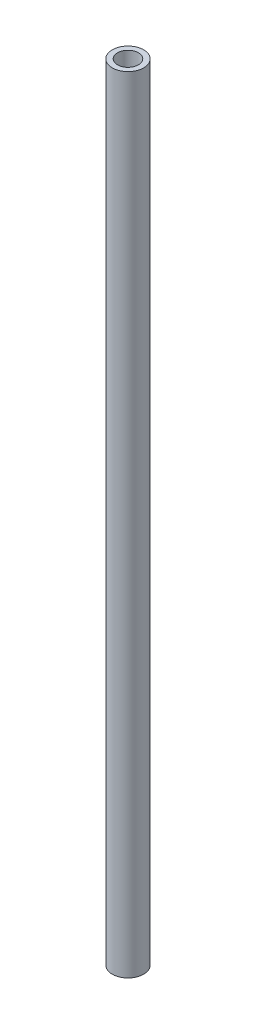
ISO-10303-21;
HEADER;
FILE_DESCRIPTION(('STEP AP214'),'2;1');
FILE_NAME('part.step','',(''),(''),'','','');
FILE_SCHEMA(('AUTOMOTIVE_DESIGN { 1 0 10303 214 1 1 1 1 }'));
ENDSEC;
DATA;
#1=APPLICATION_CONTEXT('core data for automotive mechanical design processes');
#2=APPLICATION_PROTOCOL_DEFINITION('international standard','automotive_design',2000,#1);
#3=PRODUCT_CONTEXT('',#1,'mechanical');
#4=PRODUCT('Part','Part','',(#3));
#5=PRODUCT_RELATED_PRODUCT_CATEGORY('part','',(#4));
#6=PRODUCT_DEFINITION_FORMATION('','',#4);
#7=PRODUCT_DEFINITION_CONTEXT('part definition',#1,'design');
#8=PRODUCT_DEFINITION('design','',#6,#7);
#9=PRODUCT_DEFINITION_SHAPE('','',#8);
#10=(LENGTH_UNIT() NAMED_UNIT(*) SI_UNIT(.MILLI.,.METRE.));
#11=(NAMED_UNIT(*) PLANE_ANGLE_UNIT() SI_UNIT($,.RADIAN.));
#12=(NAMED_UNIT(*) SI_UNIT($,.STERADIAN.) SOLID_ANGLE_UNIT());
#13=UNCERTAINTY_MEASURE_WITH_UNIT(LENGTH_MEASURE(1.E-05),#10,'distance_accuracy_value','');
#14=(GEOMETRIC_REPRESENTATION_CONTEXT(3) GLOBAL_UNCERTAINTY_ASSIGNED_CONTEXT((#13)) GLOBAL_UNIT_ASSIGNED_CONTEXT((#10,
#11,#12)) REPRESENTATION_CONTEXT('',''));
#15=CARTESIAN_POINT('',(0.,0.,0.));
#16=DIRECTION('',(0.,0.,1.));
#17=DIRECTION('',(1.,0.,0.));
#18=AXIS2_PLACEMENT_3D('',#15,#16,#17);
#19=CARTESIAN_POINT('',(0.,150.,0.));
#20=DIRECTION('',(0.,1.,0.));
#21=DIRECTION('',(0.,0.,1.));
#22=AXIS2_PLACEMENT_3D('',#19,#20,#21);
#23=PLANE('',#22);
#24=CARTESIAN_POINT('',(0.,150.,0.));
#25=DIRECTION('',(0.,1.,0.));
#26=DIRECTION('',(0.,0.,1.));
#27=AXIS2_PLACEMENT_3D('',#24,#25,#26);
#28=CIRCLE('',#27,6.);
#29=CARTESIAN_POINT('',(0.,150.,6.));
#30=VERTEX_POINT('',#29);
#31=EDGE_CURVE('E10',#30,#30,#28,.T.);
#32=ORIENTED_EDGE('',*,*,#31,.T.);
#33=EDGE_LOOP('',(#32));
#34=FACE_BOUND('',#33,.T.);
#35=CARTESIAN_POINT('',(0.,150.,0.));
#36=DIRECTION('',(0.,1.,0.));
#37=DIRECTION('',(0.,0.,1.));
#38=AXIS2_PLACEMENT_3D('',#35,#36,#37);
#39=CIRCLE('',#38,4.);
#40=CARTESIAN_POINT('',(0.,150.,4.));
#41=VERTEX_POINT('',#40);
#42=EDGE_CURVE('E56',#41,#41,#39,.T.);
#43=ORIENTED_EDGE('',*,*,#42,.F.);
#44=EDGE_LOOP('',(#43));
#45=FACE_BOUND('',#44,.T.);
#46=ADVANCED_FACE('F43',(#34,#45),#23,.T.);
#47=CARTESIAN_POINT('',(0.,-150.,0.));
#48=DIRECTION('',(0.,1.,0.));
#49=DIRECTION('',(0.,0.,1.));
#50=AXIS2_PLACEMENT_3D('',#47,#48,#49);
#51=PLANE('',#50);
#52=CARTESIAN_POINT('',(0.,-150.,0.));
#53=DIRECTION('',(0.,1.,0.));
#54=DIRECTION('',(0.,0.,1.));
#55=AXIS2_PLACEMENT_3D('',#52,#53,#54);
#56=CIRCLE('',#55,6.);
#57=CARTESIAN_POINT('',(0.,-150.,6.));
#58=VERTEX_POINT('',#57);
#59=EDGE_CURVE('E47',#58,#58,#56,.T.);
#60=ORIENTED_EDGE('',*,*,#59,.F.);
#61=EDGE_LOOP('',(#60));
#62=FACE_BOUND('',#61,.T.);
#63=CARTESIAN_POINT('',(0.,-150.,0.));
#64=DIRECTION('',(0.,1.,0.));
#65=DIRECTION('',(0.,0.,1.));
#66=AXIS2_PLACEMENT_3D('',#63,#64,#65);
#67=CIRCLE('',#66,4.);
#68=CARTESIAN_POINT('',(0.,-150.,4.));
#69=VERTEX_POINT('',#68);
#70=EDGE_CURVE('E58',#69,#69,#67,.T.);
#71=ORIENTED_EDGE('',*,*,#70,.T.);
#72=EDGE_LOOP('',(#71));
#73=FACE_BOUND('',#72,.T.);
#74=ADVANCED_FACE('F70',(#62,#73),#51,.F.);
#75=CARTESIAN_POINT('',(0.,150.,0.));
#76=DIRECTION('',(0.,-1.,0.));
#77=DIRECTION('',(0.,0.,-1.));
#78=AXIS2_PLACEMENT_3D('',#75,#76,#77);
#79=CYLINDRICAL_SURFACE('',#78,6.);
#80=ORIENTED_EDGE('',*,*,#31,.F.);
#81=EDGE_LOOP('',(#80));
#82=FACE_BOUND('',#81,.T.);
#83=ORIENTED_EDGE('',*,*,#59,.T.);
#84=EDGE_LOOP('',(#83));
#85=FACE_BOUND('',#84,.T.);
#86=ADVANCED_FACE('F45',(#82,#85),#79,.T.);
#87=CARTESIAN_POINT('',(0.,150.,0.));
#88=DIRECTION('',(0.,-1.,0.));
#89=DIRECTION('',(0.,0.,-1.));
#90=AXIS2_PLACEMENT_3D('',#87,#88,#89);
#91=CYLINDRICAL_SURFACE('',#90,4.);
#92=ORIENTED_EDGE('',*,*,#42,.T.);
#93=EDGE_LOOP('',(#92));
#94=FACE_BOUND('',#93,.T.);
#95=ORIENTED_EDGE('',*,*,#70,.F.);
#96=EDGE_LOOP('',(#95));
#97=FACE_BOUND('',#96,.T.);
#98=ADVANCED_FACE('F66',(#94,#97),#91,.F.);
#99=CLOSED_SHELL('',(#46,#74,#86,#98));
#100=MANIFOLD_SOLID_BREP('B2',#99);
#101=ADVANCED_BREP_SHAPE_REPRESENTATION('',(#18,#100),#14);
#102=SHAPE_DEFINITION_REPRESENTATION(#9,#101);
ENDSEC;
END-ISO-10303-21;
